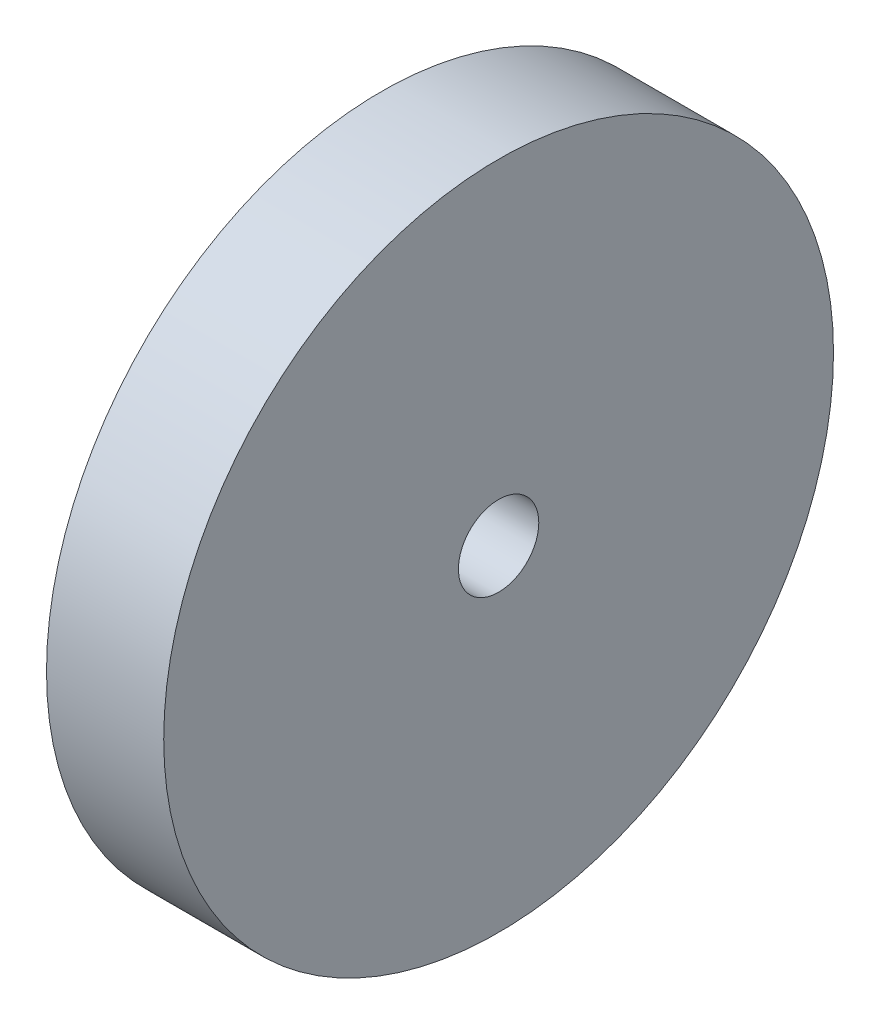
ISO-10303-21;
HEADER;
FILE_DESCRIPTION(('STEP AP214'),'2;1');
FILE_NAME('part.step','',(''),(''),'','','');
FILE_SCHEMA(('AUTOMOTIVE_DESIGN { 1 0 10303 214 1 1 1 1 }'));
ENDSEC;
DATA;
#1=APPLICATION_CONTEXT('core data for automotive mechanical design processes');
#2=APPLICATION_PROTOCOL_DEFINITION('international standard','automotive_design',2000,#1);
#3=PRODUCT_CONTEXT('',#1,'mechanical');
#4=PRODUCT('Part','Part','',(#3));
#5=PRODUCT_RELATED_PRODUCT_CATEGORY('part','',(#4));
#6=PRODUCT_DEFINITION_FORMATION('','',#4);
#7=PRODUCT_DEFINITION_CONTEXT('part definition',#1,'design');
#8=PRODUCT_DEFINITION('design','',#6,#7);
#9=PRODUCT_DEFINITION_SHAPE('','',#8);
#10=(LENGTH_UNIT() NAMED_UNIT(*) SI_UNIT(.MILLI.,.METRE.));
#11=(NAMED_UNIT(*) PLANE_ANGLE_UNIT() SI_UNIT($,.RADIAN.));
#12=(NAMED_UNIT(*) SI_UNIT($,.STERADIAN.) SOLID_ANGLE_UNIT());
#13=UNCERTAINTY_MEASURE_WITH_UNIT(LENGTH_MEASURE(1.E-05),#10,'distance_accuracy_value','');
#14=(GEOMETRIC_REPRESENTATION_CONTEXT(3) GLOBAL_UNCERTAINTY_ASSIGNED_CONTEXT((#13)) GLOBAL_UNIT_ASSIGNED_CONTEXT((#10,
#11,#12)) REPRESENTATION_CONTEXT('',''));
#15=CARTESIAN_POINT('',(0.,0.,0.));
#16=DIRECTION('',(0.,0.,1.));
#17=DIRECTION('',(1.,0.,0.));
#18=AXIS2_PLACEMENT_3D('',#15,#16,#17);
#19=CARTESIAN_POINT('',(17.5,0.,0.));
#20=DIRECTION('',(1.,0.,0.));
#21=DIRECTION('',(0.,0.,-1.));
#22=AXIS2_PLACEMENT_3D('',#19,#20,#21);
#23=PLANE('',#22);
#24=CARTESIAN_POINT('',(17.5,0.,0.));
#25=DIRECTION('',(1.,0.,0.));
#26=DIRECTION('',(0.,0.,-1.));
#27=AXIS2_PLACEMENT_3D('',#24,#25,#26);
#28=CIRCLE('',#27,50.);
#29=CARTESIAN_POINT('',(17.5,0.,-50.));
#30=VERTEX_POINT('',#29);
#31=EDGE_CURVE('E10',#30,#30,#28,.T.);
#32=ORIENTED_EDGE('',*,*,#31,.T.);
#33=EDGE_LOOP('',(#32));
#34=FACE_BOUND('',#33,.T.);
#35=CARTESIAN_POINT('',(17.5,0.,0.));
#36=DIRECTION('',(1.,0.,0.));
#37=DIRECTION('',(0.,0.,-1.));
#38=AXIS2_PLACEMENT_3D('',#35,#36,#37);
#39=CIRCLE('',#38,6.);
#40=CARTESIAN_POINT('',(17.5,0.,-6.));
#41=VERTEX_POINT('',#40);
#42=EDGE_CURVE('E41',#41,#41,#39,.T.);
#43=ORIENTED_EDGE('',*,*,#42,.F.);
#44=EDGE_LOOP('',(#43));
#45=FACE_BOUND('',#44,.T.);
#46=ADVANCED_FACE('F30',(#34,#45),#23,.T.);
#47=CARTESIAN_POINT('',(0.,0.,0.));
#48=DIRECTION('',(1.,0.,0.));
#49=DIRECTION('',(0.,0.,-1.));
#50=AXIS2_PLACEMENT_3D('',#47,#48,#49);
#51=PLANE('',#50);
#52=CARTESIAN_POINT('',(0.,0.,0.));
#53=DIRECTION('',(1.,0.,0.));
#54=DIRECTION('',(0.,0.,-1.));
#55=AXIS2_PLACEMENT_3D('',#52,#53,#54);
#56=CIRCLE('',#55,50.);
#57=CARTESIAN_POINT('',(0.,0.,-50.));
#58=VERTEX_POINT('',#57);
#59=EDGE_CURVE('E34',#58,#58,#56,.T.);
#60=ORIENTED_EDGE('',*,*,#59,.F.);
#61=EDGE_LOOP('',(#60));
#62=FACE_BOUND('',#61,.T.);
#63=CARTESIAN_POINT('',(0.,0.,0.));
#64=DIRECTION('',(1.,0.,0.));
#65=DIRECTION('',(0.,0.,-1.));
#66=AXIS2_PLACEMENT_3D('',#63,#64,#65);
#67=CIRCLE('',#66,6.);
#68=CARTESIAN_POINT('',(0.,0.,-6.));
#69=VERTEX_POINT('',#68);
#70=EDGE_CURVE('E43',#69,#69,#67,.T.);
#71=ORIENTED_EDGE('',*,*,#70,.T.);
#72=EDGE_LOOP('',(#71));
#73=FACE_BOUND('',#72,.T.);
#74=ADVANCED_FACE('F53',(#62,#73),#51,.F.);
#75=CARTESIAN_POINT('',(17.5,0.,0.));
#76=DIRECTION('',(-1.,0.,0.));
#77=DIRECTION('',(0.,0.,1.));
#78=AXIS2_PLACEMENT_3D('',#75,#76,#77);
#79=CYLINDRICAL_SURFACE('',#78,50.);
#80=ORIENTED_EDGE('',*,*,#31,.F.);
#81=EDGE_LOOP('',(#80));
#82=FACE_BOUND('',#81,.T.);
#83=ORIENTED_EDGE('',*,*,#59,.T.);
#84=EDGE_LOOP('',(#83));
#85=FACE_BOUND('',#84,.T.);
#86=ADVANCED_FACE('F32',(#82,#85),#79,.T.);
#87=CARTESIAN_POINT('',(17.5,0.,0.));
#88=DIRECTION('',(-1.,0.,0.));
#89=DIRECTION('',(0.,0.,1.));
#90=AXIS2_PLACEMENT_3D('',#87,#88,#89);
#91=CYLINDRICAL_SURFACE('',#90,6.);
#92=ORIENTED_EDGE('',*,*,#42,.T.);
#93=EDGE_LOOP('',(#92));
#94=FACE_BOUND('',#93,.T.);
#95=ORIENTED_EDGE('',*,*,#70,.F.);
#96=EDGE_LOOP('',(#95));
#97=FACE_BOUND('',#96,.T.);
#98=ADVANCED_FACE('F49',(#94,#97),#91,.F.);
#99=CLOSED_SHELL('',(#46,#74,#86,#98));
#100=MANIFOLD_SOLID_BREP('B2',#99);
#101=ADVANCED_BREP_SHAPE_REPRESENTATION('',(#18,#100),#14);
#102=SHAPE_DEFINITION_REPRESENTATION(#9,#101);
ENDSEC;
END-ISO-10303-21;
